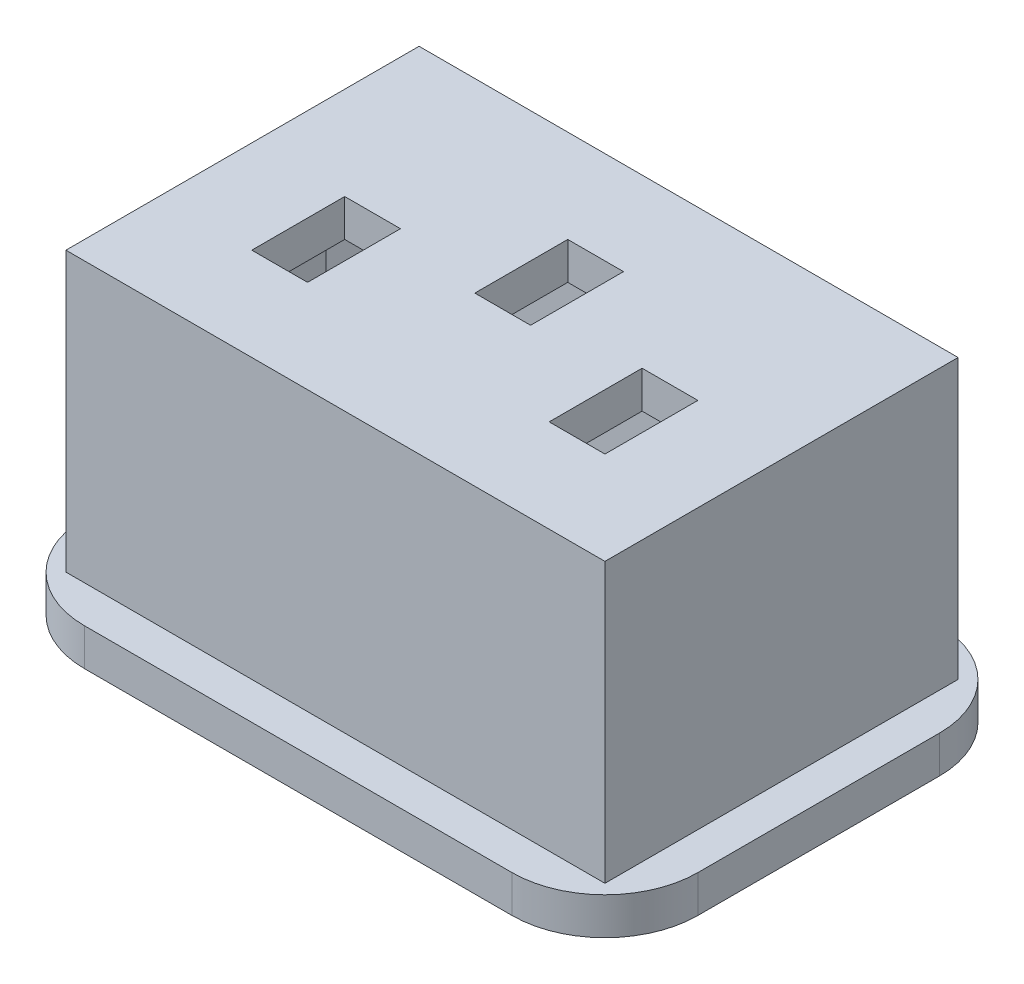
ISO-10303-21;
HEADER;
FILE_DESCRIPTION(('STEP AP214'),'2;1');
FILE_NAME('part.step','',(''),(''),'','','');
FILE_SCHEMA(('AUTOMOTIVE_DESIGN { 1 0 10303 214 1 1 1 1 }'));
ENDSEC;
DATA;
#1=APPLICATION_CONTEXT('core data for automotive mechanical design processes');
#2=APPLICATION_PROTOCOL_DEFINITION('international standard','automotive_design',2000,#1);
#3=PRODUCT_CONTEXT('',#1,'mechanical');
#4=PRODUCT('Part','Part','',(#3));
#5=PRODUCT_RELATED_PRODUCT_CATEGORY('part','',(#4));
#6=PRODUCT_DEFINITION_FORMATION('','',#4);
#7=PRODUCT_DEFINITION_CONTEXT('part definition',#1,'design');
#8=PRODUCT_DEFINITION('design','',#6,#7);
#9=PRODUCT_DEFINITION_SHAPE('','',#8);
#10=(LENGTH_UNIT() NAMED_UNIT(*) SI_UNIT(.MILLI.,.METRE.));
#11=(NAMED_UNIT(*) PLANE_ANGLE_UNIT() SI_UNIT($,.RADIAN.));
#12=(NAMED_UNIT(*) SI_UNIT($,.STERADIAN.) SOLID_ANGLE_UNIT());
#13=UNCERTAINTY_MEASURE_WITH_UNIT(LENGTH_MEASURE(1.E-05),#10,'distance_accuracy_value','');
#14=(GEOMETRIC_REPRESENTATION_CONTEXT(3) GLOBAL_UNCERTAINTY_ASSIGNED_CONTEXT((#13)) GLOBAL_UNIT_ASSIGNED_CONTEXT((#10,
#11,#12)) REPRESENTATION_CONTEXT('',''));
#15=CARTESIAN_POINT('',(0.,0.,0.));
#16=DIRECTION('',(0.,0.,1.));
#17=DIRECTION('',(1.,0.,0.));
#18=AXIS2_PLACEMENT_3D('',#15,#16,#17);
#19=CARTESIAN_POINT('',(1.,-2.,-14.));
#20=DIRECTION('',(0.,-1.,0.));
#21=DIRECTION('',(0.,0.,-1.));
#22=AXIS2_PLACEMENT_3D('',#19,#20,#21);
#23=CYLINDRICAL_SURFACE('',#22,5.);
#24=DIRECTION('',(0.,-1.,0.));
#25=VECTOR('',#24,1.);
#26=CARTESIAN_POINT('',(-4.,-2.,-14.));
#27=LINE('',#26,#25);
#28=CARTESIAN_POINT('',(-4.,0.,-14.));
#29=VERTEX_POINT('',#28);
#30=CARTESIAN_POINT('',(-4.,-2.,-14.));
#31=VERTEX_POINT('',#30);
#32=EDGE_CURVE('E466',#29,#31,#27,.T.);
#33=ORIENTED_EDGE('',*,*,#32,.F.);
#34=CARTESIAN_POINT('',(1.,0.,-14.));
#35=DIRECTION('',(0.,-1.,0.));
#36=DIRECTION('',(0.,0.,-1.));
#37=AXIS2_PLACEMENT_3D('',#34,#35,#36);
#38=CIRCLE('',#37,5.);
#39=CARTESIAN_POINT('',(1.,0.,-19.));
#40=VERTEX_POINT('',#39);
#41=EDGE_CURVE('E40',#40,#29,#38,.F.);
#42=ORIENTED_EDGE('',*,*,#41,.F.);
#43=DIRECTION('',(0.,-1.,0.));
#44=VECTOR('',#43,1.);
#45=CARTESIAN_POINT('',(1.,-2.,-19.));
#46=LINE('',#45,#44);
#47=CARTESIAN_POINT('',(1.,-2.,-19.));
#48=VERTEX_POINT('',#47);
#49=EDGE_CURVE('E469',#48,#40,#46,.F.);
#50=ORIENTED_EDGE('',*,*,#49,.F.);
#51=CARTESIAN_POINT('',(1.,-2.,-14.));
#52=DIRECTION('',(0.,-1.,0.));
#53=DIRECTION('',(0.,0.,-1.));
#54=AXIS2_PLACEMENT_3D('',#51,#52,#53);
#55=CIRCLE('',#54,5.);
#56=EDGE_CURVE('E11',#31,#48,#55,.T.);
#57=ORIENTED_EDGE('',*,*,#56,.F.);
#58=EDGE_LOOP('',(#33,#42,#50,#57));
#59=FACE_BOUND('',#58,.T.);
#60=ADVANCED_FACE('F33',(#59),#23,.T.);
#61=CARTESIAN_POINT('',(0.999999999999999,-2.,-1.));
#62=DIRECTION('',(0.,-1.,0.));
#63=DIRECTION('',(0.,0.,-1.));
#64=AXIS2_PLACEMENT_3D('',#61,#62,#63);
#65=CYLINDRICAL_SURFACE('',#64,5.);
#66=DIRECTION('',(0.,-1.,0.));
#67=VECTOR('',#66,1.);
#68=CARTESIAN_POINT('',(0.999999999999999,-2.,4.));
#69=LINE('',#68,#67);
#70=CARTESIAN_POINT('',(0.999999999999999,0.,4.));
#71=VERTEX_POINT('',#70);
#72=CARTESIAN_POINT('',(0.999999999999999,-2.,4.));
#73=VERTEX_POINT('',#72);
#74=EDGE_CURVE('E456',#71,#73,#69,.T.);
#75=ORIENTED_EDGE('',*,*,#74,.F.);
#76=CARTESIAN_POINT('',(0.999999999999999,0.,-1.));
#77=DIRECTION('',(0.,-1.,0.));
#78=DIRECTION('',(0.,0.,-1.));
#79=AXIS2_PLACEMENT_3D('',#76,#77,#78);
#80=CIRCLE('',#79,5.);
#81=CARTESIAN_POINT('',(-4.,0.,-1.));
#82=VERTEX_POINT('',#81);
#83=EDGE_CURVE('E462',#82,#71,#80,.F.);
#84=ORIENTED_EDGE('',*,*,#83,.F.);
#85=DIRECTION('',(0.,-1.,0.));
#86=VECTOR('',#85,1.);
#87=CARTESIAN_POINT('',(-4.,-2.,-1.));
#88=LINE('',#87,#86);
#89=CARTESIAN_POINT('',(-4.,-2.,-1.));
#90=VERTEX_POINT('',#89);
#91=EDGE_CURVE('E459',#90,#82,#88,.F.);
#92=ORIENTED_EDGE('',*,*,#91,.F.);
#93=CARTESIAN_POINT('',(0.999999999999999,-2.,-1.));
#94=DIRECTION('',(0.,-1.,0.));
#95=DIRECTION('',(0.,0.,-1.));
#96=AXIS2_PLACEMENT_3D('',#93,#94,#95);
#97=CIRCLE('',#96,5.);
#98=EDGE_CURVE('E464',#73,#90,#97,.T.);
#99=ORIENTED_EDGE('',*,*,#98,.F.);
#100=EDGE_LOOP('',(#75,#84,#92,#99));
#101=FACE_BOUND('',#100,.T.);
#102=ADVANCED_FACE('F481',(#101),#65,.T.);
#103=CARTESIAN_POINT('',(24.,-2.,-1.));
#104=DIRECTION('',(0.,-1.,0.));
#105=DIRECTION('',(0.,0.,-1.));
#106=AXIS2_PLACEMENT_3D('',#103,#104,#105);
#107=CYLINDRICAL_SURFACE('',#106,5.);
#108=DIRECTION('',(0.,-1.,0.));
#109=VECTOR('',#108,1.);
#110=CARTESIAN_POINT('',(29.,-2.,-0.999999999999999));
#111=LINE('',#110,#109);
#112=CARTESIAN_POINT('',(29.,0.,-0.999999999999999));
#113=VERTEX_POINT('',#112);
#114=CARTESIAN_POINT('',(29.,-2.,-0.999999999999999));
#115=VERTEX_POINT('',#114);
#116=EDGE_CURVE('E446',#113,#115,#111,.T.);
#117=ORIENTED_EDGE('',*,*,#116,.F.);
#118=CARTESIAN_POINT('',(24.,0.,-1.));
#119=DIRECTION('',(0.,-1.,0.));
#120=DIRECTION('',(0.,0.,-1.));
#121=AXIS2_PLACEMENT_3D('',#118,#119,#120);
#122=CIRCLE('',#121,5.);
#123=CARTESIAN_POINT('',(24.,0.,4.));
#124=VERTEX_POINT('',#123);
#125=EDGE_CURVE('E452',#124,#113,#122,.F.);
#126=ORIENTED_EDGE('',*,*,#125,.F.);
#127=DIRECTION('',(0.,-1.,0.));
#128=VECTOR('',#127,1.);
#129=CARTESIAN_POINT('',(24.,-2.,4.));
#130=LINE('',#129,#128);
#131=CARTESIAN_POINT('',(24.,-2.,4.));
#132=VERTEX_POINT('',#131);
#133=EDGE_CURVE('E449',#132,#124,#130,.F.);
#134=ORIENTED_EDGE('',*,*,#133,.F.);
#135=CARTESIAN_POINT('',(24.,-2.,-1.));
#136=DIRECTION('',(0.,-1.,0.));
#137=DIRECTION('',(0.,0.,-1.));
#138=AXIS2_PLACEMENT_3D('',#135,#136,#137);
#139=CIRCLE('',#138,5.);
#140=EDGE_CURVE('E454',#115,#132,#139,.T.);
#141=ORIENTED_EDGE('',*,*,#140,.F.);
#142=EDGE_LOOP('',(#117,#126,#134,#141));
#143=FACE_BOUND('',#142,.T.);
#144=ADVANCED_FACE('F490',(#143),#107,.T.);
#145=CARTESIAN_POINT('',(24.,-2.,-14.));
#146=DIRECTION('',(0.,-1.,0.));
#147=DIRECTION('',(0.,0.,-1.));
#148=AXIS2_PLACEMENT_3D('',#145,#146,#147);
#149=CYLINDRICAL_SURFACE('',#148,5.);
#150=DIRECTION('',(0.,-1.,0.));
#151=VECTOR('',#150,1.);
#152=CARTESIAN_POINT('',(24.,-2.,-19.));
#153=LINE('',#152,#151);
#154=CARTESIAN_POINT('',(24.,0.,-19.));
#155=VERTEX_POINT('',#154);
#156=CARTESIAN_POINT('',(24.,-2.,-19.));
#157=VERTEX_POINT('',#156);
#158=EDGE_CURVE('E435',#155,#157,#153,.T.);
#159=ORIENTED_EDGE('',*,*,#158,.F.);
#160=CARTESIAN_POINT('',(24.,0.,-14.));
#161=DIRECTION('',(0.,-1.,0.));
#162=DIRECTION('',(0.,0.,-1.));
#163=AXIS2_PLACEMENT_3D('',#160,#161,#162);
#164=CIRCLE('',#163,5.);
#165=CARTESIAN_POINT('',(29.,0.,-14.));
#166=VERTEX_POINT('',#165);
#167=EDGE_CURVE('E441',#166,#155,#164,.F.);
#168=ORIENTED_EDGE('',*,*,#167,.F.);
#169=DIRECTION('',(0.,-1.,0.));
#170=VECTOR('',#169,1.);
#171=CARTESIAN_POINT('',(29.,-2.,-14.));
#172=LINE('',#171,#170);
#173=CARTESIAN_POINT('',(29.,-2.,-14.));
#174=VERTEX_POINT('',#173);
#175=EDGE_CURVE('E438',#174,#166,#172,.F.);
#176=ORIENTED_EDGE('',*,*,#175,.F.);
#177=CARTESIAN_POINT('',(24.,-2.,-14.));
#178=DIRECTION('',(0.,-1.,0.));
#179=DIRECTION('',(0.,0.,-1.));
#180=AXIS2_PLACEMENT_3D('',#177,#178,#179);
#181=CIRCLE('',#180,5.);
#182=EDGE_CURVE('E444',#157,#174,#181,.T.);
#183=ORIENTED_EDGE('',*,*,#182,.F.);
#184=EDGE_LOOP('',(#159,#168,#176,#183));
#185=FACE_BOUND('',#184,.T.);
#186=ADVANCED_FACE('F498',(#185),#149,.T.);
#187=CARTESIAN_POINT('',(-2.,15.,2.));
#188=DIRECTION('',(1.,0.,0.));
#189=DIRECTION('',(0.,0.,-1.));
#190=AXIS2_PLACEMENT_3D('',#187,#188,#189);
#191=PLANE('',#190);
#192=DIRECTION('',(0.,0.,1.));
#193=VECTOR('',#192,1.);
#194=CARTESIAN_POINT('',(-2.,0.,2.));
#195=LINE('',#194,#193);
#196=CARTESIAN_POINT('',(-2.,0.,-17.));
#197=VERTEX_POINT('',#196);
#198=CARTESIAN_POINT('',(-2.,0.,2.));
#199=VERTEX_POINT('',#198);
#200=EDGE_CURVE('E395',#197,#199,#195,.T.);
#201=ORIENTED_EDGE('',*,*,#200,.T.);
#202=DIRECTION('',(0.,-1.,0.));
#203=VECTOR('',#202,1.);
#204=CARTESIAN_POINT('',(-2.,15.,2.));
#205=LINE('',#204,#203);
#206=CARTESIAN_POINT('',(-2.,15.,2.));
#207=VERTEX_POINT('',#206);
#208=EDGE_CURVE('E432',#207,#199,#205,.T.);
#209=ORIENTED_EDGE('',*,*,#208,.F.);
#210=DIRECTION('',(0.,0.,1.));
#211=VECTOR('',#210,1.);
#212=CARTESIAN_POINT('',(-2.,15.,2.));
#213=LINE('',#212,#211);
#214=CARTESIAN_POINT('',(-2.,15.,-17.));
#215=VERTEX_POINT('',#214);
#216=EDGE_CURVE('E403',#215,#207,#213,.T.);
#217=ORIENTED_EDGE('',*,*,#216,.F.);
#218=DIRECTION('',(0.,-1.,0.));
#219=VECTOR('',#218,1.);
#220=CARTESIAN_POINT('',(-2.,15.,-17.));
#221=LINE('',#220,#219);
#222=EDGE_CURVE('E413',#215,#197,#221,.T.);
#223=ORIENTED_EDGE('',*,*,#222,.T.);
#224=EDGE_LOOP('',(#201,#209,#217,#223));
#225=FACE_BOUND('',#224,.T.);
#226=ADVANCED_FACE('F522',(#225),#191,.F.);
#227=CARTESIAN_POINT('',(-2.,15.,2.));
#228=DIRECTION('',(0.,0.,-1.));
#229=DIRECTION('',(-1.,0.,0.));
#230=AXIS2_PLACEMENT_3D('',#227,#228,#229);
#231=PLANE('',#230);
#232=DIRECTION('',(1.,0.,0.));
#233=VECTOR('',#232,1.);
#234=CARTESIAN_POINT('',(-2.,0.,2.));
#235=LINE('',#234,#233);
#236=CARTESIAN_POINT('',(27.,0.,2.));
#237=VERTEX_POINT('',#236);
#238=EDGE_CURVE('E416',#199,#237,#235,.T.);
#239=ORIENTED_EDGE('',*,*,#238,.T.);
#240=DIRECTION('',(0.,-1.,0.));
#241=VECTOR('',#240,1.);
#242=CARTESIAN_POINT('',(27.,15.,2.));
#243=LINE('',#242,#241);
#244=CARTESIAN_POINT('',(27.,15.,2.));
#245=VERTEX_POINT('',#244);
#246=EDGE_CURVE('E429',#245,#237,#243,.T.);
#247=ORIENTED_EDGE('',*,*,#246,.F.);
#248=DIRECTION('',(1.,0.,0.));
#249=VECTOR('',#248,1.);
#250=CARTESIAN_POINT('',(-2.,15.,2.));
#251=LINE('',#250,#249);
#252=EDGE_CURVE('E406',#207,#245,#251,.T.);
#253=ORIENTED_EDGE('',*,*,#252,.F.);
#254=ORIENTED_EDGE('',*,*,#208,.T.);
#255=EDGE_LOOP('',(#239,#247,#253,#254));
#256=FACE_BOUND('',#255,.T.);
#257=ADVANCED_FACE('F525',(#256),#231,.F.);
#258=CARTESIAN_POINT('',(27.,15.,2.));
#259=DIRECTION('',(-1.,0.,0.));
#260=DIRECTION('',(0.,0.,1.));
#261=AXIS2_PLACEMENT_3D('',#258,#259,#260);
#262=PLANE('',#261);
#263=DIRECTION('',(0.,0.,-1.));
#264=VECTOR('',#263,1.);
#265=CARTESIAN_POINT('',(27.,0.,2.));
#266=LINE('',#265,#264);
#267=CARTESIAN_POINT('',(27.,0.,-17.));
#268=VERTEX_POINT('',#267);
#269=EDGE_CURVE('E419',#237,#268,#266,.T.);
#270=ORIENTED_EDGE('',*,*,#269,.T.);
#271=DIRECTION('',(0.,-1.,0.));
#272=VECTOR('',#271,1.);
#273=CARTESIAN_POINT('',(27.,15.,-17.));
#274=LINE('',#273,#272);
#275=CARTESIAN_POINT('',(27.,15.,-17.));
#276=VERTEX_POINT('',#275);
#277=EDGE_CURVE('E426',#276,#268,#274,.T.);
#278=ORIENTED_EDGE('',*,*,#277,.F.);
#279=DIRECTION('',(0.,0.,-1.));
#280=VECTOR('',#279,1.);
#281=CARTESIAN_POINT('',(27.,15.,2.));
#282=LINE('',#281,#280);
#283=EDGE_CURVE('E409',#245,#276,#282,.T.);
#284=ORIENTED_EDGE('',*,*,#283,.F.);
#285=ORIENTED_EDGE('',*,*,#246,.T.);
#286=EDGE_LOOP('',(#270,#278,#284,#285));
#287=FACE_BOUND('',#286,.T.);
#288=ADVANCED_FACE('F529',(#287),#262,.F.);
#289=CARTESIAN_POINT('',(-2.,15.,-17.));
#290=DIRECTION('',(0.,0.,1.));
#291=DIRECTION('',(1.,0.,0.));
#292=AXIS2_PLACEMENT_3D('',#289,#290,#291);
#293=PLANE('',#292);
#294=DIRECTION('',(-1.,0.,0.));
#295=VECTOR('',#294,1.);
#296=CARTESIAN_POINT('',(-2.,0.,-17.));
#297=LINE('',#296,#295);
#298=EDGE_CURVE('E407',#268,#197,#297,.T.);
#299=ORIENTED_EDGE('',*,*,#298,.T.);
#300=ORIENTED_EDGE('',*,*,#222,.F.);
#301=DIRECTION('',(-1.,0.,0.));
#302=VECTOR('',#301,1.);
#303=CARTESIAN_POINT('',(-2.,15.,-17.));
#304=LINE('',#303,#302);
#305=EDGE_CURVE('E411',#276,#215,#304,.T.);
#306=ORIENTED_EDGE('',*,*,#305,.F.);
#307=ORIENTED_EDGE('',*,*,#277,.T.);
#308=EDGE_LOOP('',(#299,#300,#306,#307));
#309=FACE_BOUND('',#308,.T.);
#310=ADVANCED_FACE('F533',(#309),#293,.F.);
#311=CARTESIAN_POINT('',(0.,15.,0.));
#312=DIRECTION('',(0.,-1.,0.));
#313=DIRECTION('',(0.,0.,-1.));
#314=AXIS2_PLACEMENT_3D('',#311,#312,#313);
#315=PLANE('',#314);
#316=DIRECTION('',(-1.,0.,0.));
#317=VECTOR('',#316,1.);
#318=CARTESIAN_POINT('',(0.,15.,-7.));
#319=LINE('',#318,#317);
#320=CARTESIAN_POINT('',(14.,15.,-7.));
#321=VERTEX_POINT('',#320);
#322=CARTESIAN_POINT('',(11.,15.,-7.));
#323=VERTEX_POINT('',#322);
#324=EDGE_CURVE('E342',#321,#323,#319,.T.);
#325=ORIENTED_EDGE('',*,*,#324,.T.);
#326=DIRECTION('',(0.,0.,-1.));
#327=VECTOR('',#326,1.);
#328=CARTESIAN_POINT('',(11.,15.,0.));
#329=LINE('',#328,#327);
#330=CARTESIAN_POINT('',(11.,15.,-12.));
#331=VERTEX_POINT('',#330);
#332=EDGE_CURVE('E345',#323,#331,#329,.T.);
#333=ORIENTED_EDGE('',*,*,#332,.T.);
#334=DIRECTION('',(1.,0.,0.));
#335=VECTOR('',#334,1.);
#336=CARTESIAN_POINT('',(0.,15.,-12.));
#337=LINE('',#336,#335);
#338=CARTESIAN_POINT('',(14.,15.,-12.));
#339=VERTEX_POINT('',#338);
#340=EDGE_CURVE('E336',#331,#339,#337,.T.);
#341=ORIENTED_EDGE('',*,*,#340,.T.);
#342=DIRECTION('',(0.,0.,1.));
#343=VECTOR('',#342,1.);
#344=CARTESIAN_POINT('',(14.,15.,0.));
#345=LINE('',#344,#343);
#346=EDGE_CURVE('E339',#339,#321,#345,.T.);
#347=ORIENTED_EDGE('',*,*,#346,.T.);
#348=EDGE_LOOP('',(#325,#333,#341,#347));
#349=FACE_BOUND('',#348,.T.);
#350=DIRECTION('',(-1.,0.,0.));
#351=VECTOR('',#350,1.);
#352=CARTESIAN_POINT('',(0.,15.,-3.));
#353=LINE('',#352,#351);
#354=CARTESIAN_POINT('',(22.,15.,-3.));
#355=VERTEX_POINT('',#354);
#356=CARTESIAN_POINT('',(19.,15.,-3.));
#357=VERTEX_POINT('',#356);
#358=EDGE_CURVE('E330',#355,#357,#353,.T.);
#359=ORIENTED_EDGE('',*,*,#358,.T.);
#360=DIRECTION('',(0.,0.,-1.));
#361=VECTOR('',#360,1.);
#362=CARTESIAN_POINT('',(19.,15.,0.));
#363=LINE('',#362,#361);
#364=CARTESIAN_POINT('',(19.,15.,-8.));
#365=VERTEX_POINT('',#364);
#366=EDGE_CURVE('E333',#357,#365,#363,.T.);
#367=ORIENTED_EDGE('',*,*,#366,.T.);
#368=DIRECTION('',(1.,0.,0.));
#369=VECTOR('',#368,1.);
#370=CARTESIAN_POINT('',(0.,15.,-8.));
#371=LINE('',#370,#369);
#372=CARTESIAN_POINT('',(22.,15.,-8.));
#373=VERTEX_POINT('',#372);
#374=EDGE_CURVE('E300',#365,#373,#371,.T.);
#375=ORIENTED_EDGE('',*,*,#374,.T.);
#376=DIRECTION('',(0.,0.,1.));
#377=VECTOR('',#376,1.);
#378=CARTESIAN_POINT('',(22.,15.,0.));
#379=LINE('',#378,#377);
#380=EDGE_CURVE('E327',#373,#355,#379,.T.);
#381=ORIENTED_EDGE('',*,*,#380,.T.);
#382=EDGE_LOOP('',(#359,#367,#375,#381));
#383=FACE_BOUND('',#382,.T.);
#384=DIRECTION('',(-1.,0.,0.));
#385=VECTOR('',#384,1.);
#386=CARTESIAN_POINT('',(0.,15.,-3.));
#387=LINE('',#386,#385);
#388=CARTESIAN_POINT('',(6.,15.,-3.));
#389=VERTEX_POINT('',#388);
#390=CARTESIAN_POINT('',(3.,15.,-3.));
#391=VERTEX_POINT('',#390);
#392=EDGE_CURVE('E374',#389,#391,#387,.T.);
#393=ORIENTED_EDGE('',*,*,#392,.T.);
#394=DIRECTION('',(0.,0.,-1.));
#395=VECTOR('',#394,1.);
#396=CARTESIAN_POINT('',(3.,15.,0.));
#397=LINE('',#396,#395);
#398=CARTESIAN_POINT('',(3.,15.,-8.));
#399=VERTEX_POINT('',#398);
#400=EDGE_CURVE('E377',#391,#399,#397,.T.);
#401=ORIENTED_EDGE('',*,*,#400,.T.);
#402=DIRECTION('',(1.,0.,0.));
#403=VECTOR('',#402,1.);
#404=CARTESIAN_POINT('',(0.,15.,-8.));
#405=LINE('',#404,#403);
#406=CARTESIAN_POINT('',(6.,15.,-8.));
#407=VERTEX_POINT('',#406);
#408=EDGE_CURVE('E362',#399,#407,#405,.T.);
#409=ORIENTED_EDGE('',*,*,#408,.T.);
#410=DIRECTION('',(0.,0.,1.));
#411=VECTOR('',#410,1.);
#412=CARTESIAN_POINT('',(6.,15.,0.));
#413=LINE('',#412,#411);
#414=EDGE_CURVE('E371',#407,#389,#413,.T.);
#415=ORIENTED_EDGE('',*,*,#414,.T.);
#416=EDGE_LOOP('',(#393,#401,#409,#415));
#417=FACE_BOUND('',#416,.T.);
#418=ORIENTED_EDGE('',*,*,#216,.T.);
#419=ORIENTED_EDGE('',*,*,#252,.T.);
#420=ORIENTED_EDGE('',*,*,#283,.T.);
#421=ORIENTED_EDGE('',*,*,#305,.T.);
#422=EDGE_LOOP('',(#418,#419,#420,#421));
#423=FACE_BOUND('',#422,.T.);
#424=ADVANCED_FACE('F537',(#349,#383,#417,#423),#315,.F.);
#425=CARTESIAN_POINT('',(25.,13.,0.));
#426=DIRECTION('',(0.,0.,1.));
#427=DIRECTION('',(1.,0.,0.));
#428=AXIS2_PLACEMENT_3D('',#425,#426,#427);
#429=PLANE('',#428);
#430=DIRECTION('',(0.,-1.,0.));
#431=VECTOR('',#430,1.);
#432=CARTESIAN_POINT('',(25.,13.,0.));
#433=LINE('',#432,#431);
#434=CARTESIAN_POINT('',(25.,13.,0.));
#435=VERTEX_POINT('',#434);
#436=CARTESIAN_POINT('',(25.,-2.,0.));
#437=VERTEX_POINT('',#436);
#438=EDGE_CURVE('E243',#435,#437,#433,.T.);
#439=ORIENTED_EDGE('',*,*,#438,.T.);
#440=DIRECTION('',(-1.,0.,0.));
#441=VECTOR('',#440,1.);
#442=CARTESIAN_POINT('',(25.,-2.,0.));
#443=LINE('',#442,#441);
#444=CARTESIAN_POINT('',(0.,-2.,0.));
#445=VERTEX_POINT('',#444);
#446=EDGE_CURVE('E241',#437,#445,#443,.T.);
#447=ORIENTED_EDGE('',*,*,#446,.T.);
#448=DIRECTION('',(0.,-1.,0.));
#449=VECTOR('',#448,1.);
#450=CARTESIAN_POINT('',(0.,13.,0.));
#451=LINE('',#450,#449);
#452=CARTESIAN_POINT('',(0.,13.,0.));
#453=VERTEX_POINT('',#452);
#454=EDGE_CURVE('E226',#453,#445,#451,.T.);
#455=ORIENTED_EDGE('',*,*,#454,.F.);
#456=DIRECTION('',(-1.,0.,0.));
#457=VECTOR('',#456,1.);
#458=CARTESIAN_POINT('',(25.,13.,0.));
#459=LINE('',#458,#457);
#460=EDGE_CURVE('E380',#435,#453,#459,.T.);
#461=ORIENTED_EDGE('',*,*,#460,.F.);
#462=EDGE_LOOP('',(#439,#447,#455,#461));
#463=FACE_BOUND('',#462,.T.);
#464=ADVANCED_FACE('F242',(#463),#429,.F.);
#465=CARTESIAN_POINT('',(25.,13.,-10.));
#466=DIRECTION('',(1.,0.,0.));
#467=DIRECTION('',(0.,0.,-1.));
#468=AXIS2_PLACEMENT_3D('',#465,#466,#467);
#469=PLANE('',#468);
#470=DIRECTION('',(0.,-1.,0.));
#471=VECTOR('',#470,1.);
#472=CARTESIAN_POINT('',(25.,13.,-10.));
#473=LINE('',#472,#471);
#474=CARTESIAN_POINT('',(25.,13.,-10.));
#475=VERTEX_POINT('',#474);
#476=CARTESIAN_POINT('',(25.,-2.,-10.));
#477=VERTEX_POINT('',#476);
#478=EDGE_CURVE('E396',#475,#477,#473,.T.);
#479=ORIENTED_EDGE('',*,*,#478,.T.);
#480=DIRECTION('',(0.,0.,1.));
#481=VECTOR('',#480,1.);
#482=CARTESIAN_POINT('',(25.,-2.,-10.));
#483=LINE('',#482,#481);
#484=EDGE_CURVE('E261',#477,#437,#483,.T.);
#485=ORIENTED_EDGE('',*,*,#484,.T.);
#486=ORIENTED_EDGE('',*,*,#438,.F.);
#487=DIRECTION('',(0.,0.,1.));
#488=VECTOR('',#487,1.);
#489=CARTESIAN_POINT('',(25.,13.,-10.));
#490=LINE('',#489,#488);
#491=EDGE_CURVE('E238',#475,#435,#490,.T.);
#492=ORIENTED_EDGE('',*,*,#491,.F.);
#493=EDGE_LOOP('',(#479,#485,#486,#492));
#494=FACE_BOUND('',#493,.T.);
#495=ADVANCED_FACE('F544',(#494),#469,.F.);
#496=CARTESIAN_POINT('',(20.,13.,-15.));
#497=DIRECTION('',(0.707106781186547,0.,-0.707106781186548));
#498=DIRECTION('',(-0.707106781186548,0.,-0.707106781186547));
#499=AXIS2_PLACEMENT_3D('',#496,#497,#498);
#500=PLANE('',#499);
#501=DIRECTION('',(0.,-1.,0.));
#502=VECTOR('',#501,1.);
#503=CARTESIAN_POINT('',(20.,13.,-15.));
#504=LINE('',#503,#502);
#505=CARTESIAN_POINT('',(20.,13.,-15.));
#506=VERTEX_POINT('',#505);
#507=CARTESIAN_POINT('',(20.,-2.,-15.));
#508=VERTEX_POINT('',#507);
#509=EDGE_CURVE('E398',#506,#508,#504,.T.);
#510=ORIENTED_EDGE('',*,*,#509,.T.);
#511=DIRECTION('',(0.707106781186548,0.,0.707106781186547));
#512=VECTOR('',#511,1.);
#513=CARTESIAN_POINT('',(20.,-2.,-15.));
#514=LINE('',#513,#512);
#515=EDGE_CURVE('E258',#508,#477,#514,.T.);
#516=ORIENTED_EDGE('',*,*,#515,.T.);
#517=ORIENTED_EDGE('',*,*,#478,.F.);
#518=DIRECTION('',(0.707106781186548,0.,0.707106781186547));
#519=VECTOR('',#518,1.);
#520=CARTESIAN_POINT('',(20.,13.,-15.));
#521=LINE('',#520,#519);
#522=EDGE_CURVE('E389',#506,#475,#521,.T.);
#523=ORIENTED_EDGE('',*,*,#522,.F.);
#524=EDGE_LOOP('',(#510,#516,#517,#523));
#525=FACE_BOUND('',#524,.T.);
#526=ADVANCED_FACE('F555',(#525),#500,.F.);
#527=CARTESIAN_POINT('',(5.,13.,-15.));
#528=DIRECTION('',(0.,0.,-1.));
#529=DIRECTION('',(-1.,0.,0.));
#530=AXIS2_PLACEMENT_3D('',#527,#528,#529);
#531=PLANE('',#530);
#532=DIRECTION('',(0.,-1.,0.));
#533=VECTOR('',#532,1.);
#534=CARTESIAN_POINT('',(5.,13.,-15.));
#535=LINE('',#534,#533);
#536=CARTESIAN_POINT('',(5.,13.,-15.));
#537=VERTEX_POINT('',#536);
#538=CARTESIAN_POINT('',(5.,-2.,-15.));
#539=VERTEX_POINT('',#538);
#540=EDGE_CURVE('E400',#537,#539,#535,.T.);
#541=ORIENTED_EDGE('',*,*,#540,.T.);
#542=DIRECTION('',(1.,0.,0.));
#543=VECTOR('',#542,1.);
#544=CARTESIAN_POINT('',(5.,-2.,-15.));
#545=LINE('',#544,#543);
#546=EDGE_CURVE('E253',#539,#508,#545,.T.);
#547=ORIENTED_EDGE('',*,*,#546,.T.);
#548=ORIENTED_EDGE('',*,*,#509,.F.);
#549=DIRECTION('',(1.,0.,0.));
#550=VECTOR('',#549,1.);
#551=CARTESIAN_POINT('',(5.,13.,-15.));
#552=LINE('',#551,#550);
#553=EDGE_CURVE('E386',#537,#506,#552,.T.);
#554=ORIENTED_EDGE('',*,*,#553,.F.);
#555=EDGE_LOOP('',(#541,#547,#548,#554));
#556=FACE_BOUND('',#555,.T.);
#557=ADVANCED_FACE('F551',(#556),#531,.F.);
#558=CARTESIAN_POINT('',(0.,13.,-9.99999999999998));
#559=DIRECTION('',(-0.707106781186548,0.,-0.707106781186547));
#560=DIRECTION('',(-0.707106781186547,0.,0.707106781186548));
#561=AXIS2_PLACEMENT_3D('',#558,#559,#560);
#562=PLANE('',#561);
#563=DIRECTION('',(0.,-1.,0.));
#564=VECTOR('',#563,1.);
#565=CARTESIAN_POINT('',(0.,13.,-9.99999999999998));
#566=LINE('',#565,#564);
#567=CARTESIAN_POINT('',(0.,13.,-9.99999999999998));
#568=VERTEX_POINT('',#567);
#569=CARTESIAN_POINT('',(0.,-2.,-9.99999999999998));
#570=VERTEX_POINT('',#569);
#571=EDGE_CURVE('E237',#568,#570,#566,.T.);
#572=ORIENTED_EDGE('',*,*,#571,.T.);
#573=DIRECTION('',(0.707106781186547,0.,-0.707106781186548));
#574=VECTOR('',#573,1.);
#575=CARTESIAN_POINT('',(0.,-2.,-9.99999999999998));
#576=LINE('',#575,#574);
#577=EDGE_CURVE('E251',#570,#539,#576,.T.);
#578=ORIENTED_EDGE('',*,*,#577,.T.);
#579=ORIENTED_EDGE('',*,*,#540,.F.);
#580=DIRECTION('',(0.707106781186547,0.,-0.707106781186548));
#581=VECTOR('',#580,1.);
#582=CARTESIAN_POINT('',(0.,13.,-9.99999999999998));
#583=LINE('',#582,#581);
#584=EDGE_CURVE('E383',#568,#537,#583,.T.);
#585=ORIENTED_EDGE('',*,*,#584,.F.);
#586=EDGE_LOOP('',(#572,#578,#579,#585));
#587=FACE_BOUND('',#586,.T.);
#588=ADVANCED_FACE('F548',(#587),#562,.F.);
#589=CARTESIAN_POINT('',(0.,13.,0.));
#590=DIRECTION('',(-1.,0.,0.));
#591=DIRECTION('',(0.,0.,1.));
#592=AXIS2_PLACEMENT_3D('',#589,#590,#591);
#593=PLANE('',#592);
#594=ORIENTED_EDGE('',*,*,#454,.T.);
#595=DIRECTION('',(0.,0.,-1.));
#596=VECTOR('',#595,1.);
#597=CARTESIAN_POINT('',(0.,-2.,0.));
#598=LINE('',#597,#596);
#599=EDGE_CURVE('E230',#445,#570,#598,.T.);
#600=ORIENTED_EDGE('',*,*,#599,.T.);
#601=ORIENTED_EDGE('',*,*,#571,.F.);
#602=DIRECTION('',(0.,0.,-1.));
#603=VECTOR('',#602,1.);
#604=CARTESIAN_POINT('',(0.,13.,0.));
#605=LINE('',#604,#603);
#606=EDGE_CURVE('E233',#453,#568,#605,.T.);
#607=ORIENTED_EDGE('',*,*,#606,.F.);
#608=EDGE_LOOP('',(#594,#600,#601,#607));
#609=FACE_BOUND('',#608,.T.);
#610=ADVANCED_FACE('F228',(#609),#593,.F.);
#611=CARTESIAN_POINT('',(0.,13.,0.));
#612=DIRECTION('',(0.,-1.,0.));
#613=DIRECTION('',(0.,0.,-1.));
#614=AXIS2_PLACEMENT_3D('',#611,#612,#613);
#615=PLANE('',#614);
#616=DIRECTION('',(0.,0.,-1.));
#617=VECTOR('',#616,1.);
#618=CARTESIAN_POINT('',(11.,13.,-7.));
#619=LINE('',#618,#617);
#620=CARTESIAN_POINT('',(11.,13.,-7.));
#621=VERTEX_POINT('',#620);
#622=CARTESIAN_POINT('',(11.,13.,-12.));
#623=VERTEX_POINT('',#622);
#624=EDGE_CURVE('E285',#621,#623,#619,.T.);
#625=ORIENTED_EDGE('',*,*,#624,.F.);
#626=DIRECTION('',(-1.,0.,0.));
#627=VECTOR('',#626,1.);
#628=CARTESIAN_POINT('',(11.,13.,-7.));
#629=LINE('',#628,#627);
#630=CARTESIAN_POINT('',(14.,13.,-7.));
#631=VERTEX_POINT('',#630);
#632=EDGE_CURVE('E294',#631,#621,#629,.T.);
#633=ORIENTED_EDGE('',*,*,#632,.F.);
#634=DIRECTION('',(0.,0.,1.));
#635=VECTOR('',#634,1.);
#636=CARTESIAN_POINT('',(14.,13.,-7.));
#637=LINE('',#636,#635);
#638=CARTESIAN_POINT('',(14.,13.,-12.));
#639=VERTEX_POINT('',#638);
#640=EDGE_CURVE('E291',#639,#631,#637,.T.);
#641=ORIENTED_EDGE('',*,*,#640,.F.);
#642=DIRECTION('',(1.,0.,0.));
#643=VECTOR('',#642,1.);
#644=CARTESIAN_POINT('',(11.,13.,-12.));
#645=LINE('',#644,#643);
#646=EDGE_CURVE('E287',#623,#639,#645,.T.);
#647=ORIENTED_EDGE('',*,*,#646,.F.);
#648=EDGE_LOOP('',(#625,#633,#641,#647));
#649=FACE_BOUND('',#648,.T.);
#650=DIRECTION('',(0.,0.,-1.));
#651=VECTOR('',#650,1.);
#652=CARTESIAN_POINT('',(19.,13.,-3.));
#653=LINE('',#652,#651);
#654=CARTESIAN_POINT('',(19.,13.,-3.));
#655=VERTEX_POINT('',#654);
#656=CARTESIAN_POINT('',(19.,13.,-8.));
#657=VERTEX_POINT('',#656);
#658=EDGE_CURVE('E275',#655,#657,#653,.T.);
#659=ORIENTED_EDGE('',*,*,#658,.F.);
#660=DIRECTION('',(-1.,0.,0.));
#661=VECTOR('',#660,1.);
#662=CARTESIAN_POINT('',(19.,13.,-3.));
#663=LINE('',#662,#661);
#664=CARTESIAN_POINT('',(22.,13.,-3.));
#665=VERTEX_POINT('',#664);
#666=EDGE_CURVE('E314',#665,#655,#663,.T.);
#667=ORIENTED_EDGE('',*,*,#666,.F.);
#668=DIRECTION('',(0.,0.,1.));
#669=VECTOR('',#668,1.);
#670=CARTESIAN_POINT('',(22.,13.,-3.));
#671=LINE('',#670,#669);
#672=CARTESIAN_POINT('',(22.,13.,-8.));
#673=VERTEX_POINT('',#672);
#674=EDGE_CURVE('E311',#673,#665,#671,.T.);
#675=ORIENTED_EDGE('',*,*,#674,.F.);
#676=DIRECTION('',(1.,0.,0.));
#677=VECTOR('',#676,1.);
#678=CARTESIAN_POINT('',(19.,13.,-8.));
#679=LINE('',#678,#677);
#680=EDGE_CURVE('E308',#657,#673,#679,.T.);
#681=ORIENTED_EDGE('',*,*,#680,.F.);
#682=EDGE_LOOP('',(#659,#667,#675,#681));
#683=FACE_BOUND('',#682,.T.);
#684=DIRECTION('',(0.,0.,-1.));
#685=VECTOR('',#684,1.);
#686=CARTESIAN_POINT('',(3.,13.,-3.));
#687=LINE('',#686,#685);
#688=CARTESIAN_POINT('',(3.,13.,-3.));
#689=VERTEX_POINT('',#688);
#690=CARTESIAN_POINT('',(3.,13.,-8.));
#691=VERTEX_POINT('',#690);
#692=EDGE_CURVE('E348',#689,#691,#687,.T.);
#693=ORIENTED_EDGE('',*,*,#692,.F.);
#694=DIRECTION('',(-1.,0.,0.));
#695=VECTOR('',#694,1.);
#696=CARTESIAN_POINT('',(3.,13.,-3.));
#697=LINE('',#696,#695);
#698=CARTESIAN_POINT('',(6.,13.,-3.));
#699=VERTEX_POINT('',#698);
#700=EDGE_CURVE('E356',#699,#689,#697,.T.);
#701=ORIENTED_EDGE('',*,*,#700,.F.);
#702=DIRECTION('',(0.,0.,1.));
#703=VECTOR('',#702,1.);
#704=CARTESIAN_POINT('',(6.,13.,-3.));
#705=LINE('',#704,#703);
#706=CARTESIAN_POINT('',(6.,13.,-8.));
#707=VERTEX_POINT('',#706);
#708=EDGE_CURVE('E353',#707,#699,#705,.T.);
#709=ORIENTED_EDGE('',*,*,#708,.F.);
#710=DIRECTION('',(1.,0.,0.));
#711=VECTOR('',#710,1.);
#712=CARTESIAN_POINT('',(3.,13.,-8.));
#713=LINE('',#712,#711);
#714=EDGE_CURVE('E350',#691,#707,#713,.T.);
#715=ORIENTED_EDGE('',*,*,#714,.F.);
#716=EDGE_LOOP('',(#693,#701,#709,#715));
#717=FACE_BOUND('',#716,.T.);
#718=ORIENTED_EDGE('',*,*,#460,.T.);
#719=ORIENTED_EDGE('',*,*,#606,.T.);
#720=ORIENTED_EDGE('',*,*,#584,.T.);
#721=ORIENTED_EDGE('',*,*,#553,.T.);
#722=ORIENTED_EDGE('',*,*,#522,.T.);
#723=ORIENTED_EDGE('',*,*,#491,.T.);
#724=EDGE_LOOP('',(#718,#719,#720,#721,#722,#723));
#725=FACE_BOUND('',#724,.T.);
#726=ADVANCED_FACE('F547',(#649,#683,#717,#725),#615,.T.);
#727=CARTESIAN_POINT('',(3.,26.,-3.));
#728=DIRECTION('',(-1.,0.,0.));
#729=DIRECTION('',(0.,0.,1.));
#730=AXIS2_PLACEMENT_3D('',#727,#728,#729);
#731=PLANE('',#730);
#732=DIRECTION('',(0.,-1.,0.));
#733=VECTOR('',#732,1.);
#734=CARTESIAN_POINT('',(3.,26.,-3.));
#735=LINE('',#734,#733);
#736=EDGE_CURVE('E360',#391,#689,#735,.T.);
#737=ORIENTED_EDGE('',*,*,#736,.T.);
#738=ORIENTED_EDGE('',*,*,#692,.T.);
#739=DIRECTION('',(0.,-1.,0.));
#740=VECTOR('',#739,1.);
#741=CARTESIAN_POINT('',(3.,26.,-8.));
#742=LINE('',#741,#740);
#743=EDGE_CURVE('E359',#399,#691,#742,.T.);
#744=ORIENTED_EDGE('',*,*,#743,.F.);
#745=ORIENTED_EDGE('',*,*,#400,.F.);
#746=EDGE_LOOP('',(#737,#738,#744,#745));
#747=FACE_BOUND('',#746,.T.);
#748=ADVANCED_FACE('F565',(#747),#731,.F.);
#749=CARTESIAN_POINT('',(3.,26.,-3.));
#750=DIRECTION('',(0.,0.,1.));
#751=DIRECTION('',(1.,0.,0.));
#752=AXIS2_PLACEMENT_3D('',#749,#750,#751);
#753=PLANE('',#752);
#754=DIRECTION('',(0.,-1.,0.));
#755=VECTOR('',#754,1.);
#756=CARTESIAN_POINT('',(6.,26.,-3.));
#757=LINE('',#756,#755);
#758=EDGE_CURVE('E363',#389,#699,#757,.T.);
#759=ORIENTED_EDGE('',*,*,#758,.T.);
#760=ORIENTED_EDGE('',*,*,#700,.T.);
#761=ORIENTED_EDGE('',*,*,#736,.F.);
#762=ORIENTED_EDGE('',*,*,#392,.F.);
#763=EDGE_LOOP('',(#759,#760,#761,#762));
#764=FACE_BOUND('',#763,.T.);
#765=ADVANCED_FACE('F569',(#764),#753,.F.);
#766=CARTESIAN_POINT('',(6.,26.,-3.));
#767=DIRECTION('',(1.,0.,0.));
#768=DIRECTION('',(0.,0.,-1.));
#769=AXIS2_PLACEMENT_3D('',#766,#767,#768);
#770=PLANE('',#769);
#771=DIRECTION('',(0.,-1.,0.));
#772=VECTOR('',#771,1.);
#773=CARTESIAN_POINT('',(6.,26.,-8.));
#774=LINE('',#773,#772);
#775=EDGE_CURVE('E365',#407,#707,#774,.T.);
#776=ORIENTED_EDGE('',*,*,#775,.T.);
#777=ORIENTED_EDGE('',*,*,#708,.T.);
#778=ORIENTED_EDGE('',*,*,#758,.F.);
#779=ORIENTED_EDGE('',*,*,#414,.F.);
#780=EDGE_LOOP('',(#776,#777,#778,#779));
#781=FACE_BOUND('',#780,.T.);
#782=ADVANCED_FACE('F575',(#781),#770,.F.);
#783=CARTESIAN_POINT('',(3.,26.,-8.));
#784=DIRECTION('',(0.,0.,-1.));
#785=DIRECTION('',(-1.,0.,0.));
#786=AXIS2_PLACEMENT_3D('',#783,#784,#785);
#787=PLANE('',#786);
#788=ORIENTED_EDGE('',*,*,#743,.T.);
#789=ORIENTED_EDGE('',*,*,#714,.T.);
#790=ORIENTED_EDGE('',*,*,#775,.F.);
#791=ORIENTED_EDGE('',*,*,#408,.F.);
#792=EDGE_LOOP('',(#788,#789,#790,#791));
#793=FACE_BOUND('',#792,.T.);
#794=ADVANCED_FACE('F571',(#793),#787,.F.);
#795=CARTESIAN_POINT('',(19.,26.,-3.));
#796=DIRECTION('',(-1.,0.,0.));
#797=DIRECTION('',(0.,0.,1.));
#798=AXIS2_PLACEMENT_3D('',#795,#796,#797);
#799=PLANE('',#798);
#800=DIRECTION('',(0.,-1.,0.));
#801=VECTOR('',#800,1.);
#802=CARTESIAN_POINT('',(19.,26.,-3.));
#803=LINE('',#802,#801);
#804=EDGE_CURVE('E288',#357,#655,#803,.T.);
#805=ORIENTED_EDGE('',*,*,#804,.T.);
#806=ORIENTED_EDGE('',*,*,#658,.T.);
#807=DIRECTION('',(0.,-1.,0.));
#808=VECTOR('',#807,1.);
#809=CARTESIAN_POINT('',(19.,26.,-8.));
#810=LINE('',#809,#808);
#811=EDGE_CURVE('E317',#365,#657,#810,.T.);
#812=ORIENTED_EDGE('',*,*,#811,.F.);
#813=ORIENTED_EDGE('',*,*,#366,.F.);
#814=EDGE_LOOP('',(#805,#806,#812,#813));
#815=FACE_BOUND('',#814,.T.);
#816=ADVANCED_FACE('F574',(#815),#799,.F.);
#817=CARTESIAN_POINT('',(19.,26.,-3.));
#818=DIRECTION('',(0.,0.,1.));
#819=DIRECTION('',(1.,0.,0.));
#820=AXIS2_PLACEMENT_3D('',#817,#818,#819);
#821=PLANE('',#820);
#822=DIRECTION('',(0.,-1.,0.));
#823=VECTOR('',#822,1.);
#824=CARTESIAN_POINT('',(22.,26.,-3.));
#825=LINE('',#824,#823);
#826=EDGE_CURVE('E319',#355,#665,#825,.T.);
#827=ORIENTED_EDGE('',*,*,#826,.T.);
#828=ORIENTED_EDGE('',*,*,#666,.T.);
#829=ORIENTED_EDGE('',*,*,#804,.F.);
#830=ORIENTED_EDGE('',*,*,#358,.F.);
#831=EDGE_LOOP('',(#827,#828,#829,#830));
#832=FACE_BOUND('',#831,.T.);
#833=ADVANCED_FACE('F585',(#832),#821,.F.);
#834=CARTESIAN_POINT('',(22.,26.,-3.));
#835=DIRECTION('',(1.,0.,0.));
#836=DIRECTION('',(0.,0.,-1.));
#837=AXIS2_PLACEMENT_3D('',#834,#835,#836);
#838=PLANE('',#837);
#839=DIRECTION('',(0.,-1.,0.));
#840=VECTOR('',#839,1.);
#841=CARTESIAN_POINT('',(22.,26.,-8.));
#842=LINE('',#841,#840);
#843=EDGE_CURVE('E321',#373,#673,#842,.T.);
#844=ORIENTED_EDGE('',*,*,#843,.T.);
#845=ORIENTED_EDGE('',*,*,#674,.T.);
#846=ORIENTED_EDGE('',*,*,#826,.F.);
#847=ORIENTED_EDGE('',*,*,#380,.F.);
#848=EDGE_LOOP('',(#844,#845,#846,#847));
#849=FACE_BOUND('',#848,.T.);
#850=ADVANCED_FACE('F591',(#849),#838,.F.);
#851=CARTESIAN_POINT('',(19.,26.,-8.));
#852=DIRECTION('',(0.,0.,-1.));
#853=DIRECTION('',(-1.,0.,0.));
#854=AXIS2_PLACEMENT_3D('',#851,#852,#853);
#855=PLANE('',#854);
#856=ORIENTED_EDGE('',*,*,#811,.T.);
#857=ORIENTED_EDGE('',*,*,#680,.T.);
#858=ORIENTED_EDGE('',*,*,#843,.F.);
#859=ORIENTED_EDGE('',*,*,#374,.F.);
#860=EDGE_LOOP('',(#856,#857,#858,#859));
#861=FACE_BOUND('',#860,.T.);
#862=ADVANCED_FACE('F587',(#861),#855,.F.);
#863=CARTESIAN_POINT('',(11.,26.,-7.));
#864=DIRECTION('',(-1.,0.,0.));
#865=DIRECTION('',(0.,0.,1.));
#866=AXIS2_PLACEMENT_3D('',#863,#864,#865);
#867=PLANE('',#866);
#868=DIRECTION('',(0.,-1.,0.));
#869=VECTOR('',#868,1.);
#870=CARTESIAN_POINT('',(11.,26.,-7.));
#871=LINE('',#870,#869);
#872=EDGE_CURVE('E298',#323,#621,#871,.T.);
#873=ORIENTED_EDGE('',*,*,#872,.T.);
#874=ORIENTED_EDGE('',*,*,#624,.T.);
#875=DIRECTION('',(0.,-1.,0.));
#876=VECTOR('',#875,1.);
#877=CARTESIAN_POINT('',(11.,26.,-12.));
#878=LINE('',#877,#876);
#879=EDGE_CURVE('E297',#331,#623,#878,.T.);
#880=ORIENTED_EDGE('',*,*,#879,.F.);
#881=ORIENTED_EDGE('',*,*,#332,.F.);
#882=EDGE_LOOP('',(#873,#874,#880,#881));
#883=FACE_BOUND('',#882,.T.);
#884=ADVANCED_FACE('F590',(#883),#867,.F.);
#885=CARTESIAN_POINT('',(11.,26.,-7.));
#886=DIRECTION('',(0.,0.,1.));
#887=DIRECTION('',(1.,0.,0.));
#888=AXIS2_PLACEMENT_3D('',#885,#886,#887);
#889=PLANE('',#888);
#890=DIRECTION('',(0.,-1.,0.));
#891=VECTOR('',#890,1.);
#892=CARTESIAN_POINT('',(14.,26.,-7.));
#893=LINE('',#892,#891);
#894=EDGE_CURVE('E301',#321,#631,#893,.T.);
#895=ORIENTED_EDGE('',*,*,#894,.T.);
#896=ORIENTED_EDGE('',*,*,#632,.T.);
#897=ORIENTED_EDGE('',*,*,#872,.F.);
#898=ORIENTED_EDGE('',*,*,#324,.F.);
#899=EDGE_LOOP('',(#895,#896,#897,#898));
#900=FACE_BOUND('',#899,.T.);
#901=ADVANCED_FACE('F601',(#900),#889,.F.);
#902=CARTESIAN_POINT('',(14.,26.,-7.));
#903=DIRECTION('',(1.,0.,0.));
#904=DIRECTION('',(0.,0.,-1.));
#905=AXIS2_PLACEMENT_3D('',#902,#903,#904);
#906=PLANE('',#905);
#907=DIRECTION('',(0.,-1.,0.));
#908=VECTOR('',#907,1.);
#909=CARTESIAN_POINT('',(14.,26.,-12.));
#910=LINE('',#909,#908);
#911=EDGE_CURVE('E303',#339,#639,#910,.T.);
#912=ORIENTED_EDGE('',*,*,#911,.T.);
#913=ORIENTED_EDGE('',*,*,#640,.T.);
#914=ORIENTED_EDGE('',*,*,#894,.F.);
#915=ORIENTED_EDGE('',*,*,#346,.F.);
#916=EDGE_LOOP('',(#912,#913,#914,#915));
#917=FACE_BOUND('',#916,.T.);
#918=ADVANCED_FACE('F605',(#917),#906,.F.);
#919=CARTESIAN_POINT('',(11.,26.,-12.));
#920=DIRECTION('',(0.,0.,-1.));
#921=DIRECTION('',(-1.,0.,0.));
#922=AXIS2_PLACEMENT_3D('',#919,#920,#921);
#923=PLANE('',#922);
#924=ORIENTED_EDGE('',*,*,#879,.T.);
#925=ORIENTED_EDGE('',*,*,#646,.T.);
#926=ORIENTED_EDGE('',*,*,#911,.F.);
#927=ORIENTED_EDGE('',*,*,#340,.F.);
#928=EDGE_LOOP('',(#924,#925,#926,#927));
#929=FACE_BOUND('',#928,.T.);
#930=ADVANCED_FACE('F509',(#929),#923,.F.);
#931=CARTESIAN_POINT('',(0.,0.,0.));
#932=DIRECTION('',(0.,-1.,0.));
#933=DIRECTION('',(0.,0.,-1.));
#934=AXIS2_PLACEMENT_3D('',#931,#932,#933);
#935=PLANE('',#934);
#936=DIRECTION('',(1.,0.,0.));
#937=VECTOR('',#936,1.);
#938=CARTESIAN_POINT('',(-4.,0.,-19.));
#939=LINE('',#938,#937);
#940=EDGE_CURVE('E278',#40,#155,#939,.T.);
#941=ORIENTED_EDGE('',*,*,#940,.F.);
#942=ORIENTED_EDGE('',*,*,#41,.T.);
#943=DIRECTION('',(0.,0.,-1.));
#944=VECTOR('',#943,1.);
#945=CARTESIAN_POINT('',(-4.,0.,4.));
#946=LINE('',#945,#944);
#947=EDGE_CURVE('E263',#82,#29,#946,.T.);
#948=ORIENTED_EDGE('',*,*,#947,.F.);
#949=ORIENTED_EDGE('',*,*,#83,.T.);
#950=DIRECTION('',(-1.,0.,0.));
#951=VECTOR('',#950,1.);
#952=CARTESIAN_POINT('',(-4.,0.,4.));
#953=LINE('',#952,#951);
#954=EDGE_CURVE('E267',#124,#71,#953,.T.);
#955=ORIENTED_EDGE('',*,*,#954,.F.);
#956=ORIENTED_EDGE('',*,*,#125,.T.);
#957=DIRECTION('',(0.,0.,1.));
#958=VECTOR('',#957,1.);
#959=CARTESIAN_POINT('',(29.,0.,4.));
#960=LINE('',#959,#958);
#961=EDGE_CURVE('E280',#166,#113,#960,.T.);
#962=ORIENTED_EDGE('',*,*,#961,.F.);
#963=ORIENTED_EDGE('',*,*,#167,.T.);
#964=EDGE_LOOP('',(#941,#942,#948,#949,#955,#956,#962,#963));
#965=FACE_BOUND('',#964,.T.);
#966=ORIENTED_EDGE('',*,*,#238,.F.);
#967=ORIENTED_EDGE('',*,*,#200,.F.);
#968=ORIENTED_EDGE('',*,*,#298,.F.);
#969=ORIENTED_EDGE('',*,*,#269,.F.);
#970=EDGE_LOOP('',(#966,#967,#968,#969));
#971=FACE_BOUND('',#970,.T.);
#972=ADVANCED_FACE('F473',(#965,#971),#935,.F.);
#973=CARTESIAN_POINT('',(0.,-2.,0.));
#974=DIRECTION('',(0.,-1.,0.));
#975=DIRECTION('',(0.,0.,-1.));
#976=AXIS2_PLACEMENT_3D('',#973,#974,#975);
#977=PLANE('',#976);
#978=DIRECTION('',(0.,0.,-1.));
#979=VECTOR('',#978,1.);
#980=CARTESIAN_POINT('',(-4.,-2.,4.));
#981=LINE('',#980,#979);
#982=EDGE_CURVE('E264',#90,#31,#981,.T.);
#983=ORIENTED_EDGE('',*,*,#982,.T.);
#984=ORIENTED_EDGE('',*,*,#56,.T.);
#985=DIRECTION('',(1.,0.,0.));
#986=VECTOR('',#985,1.);
#987=CARTESIAN_POINT('',(-4.,-2.,-19.));
#988=LINE('',#987,#986);
#989=EDGE_CURVE('E266',#48,#157,#988,.T.);
#990=ORIENTED_EDGE('',*,*,#989,.T.);
#991=ORIENTED_EDGE('',*,*,#182,.T.);
#992=DIRECTION('',(0.,0.,1.));
#993=VECTOR('',#992,1.);
#994=CARTESIAN_POINT('',(29.,-2.,4.));
#995=LINE('',#994,#993);
#996=EDGE_CURVE('E269',#174,#115,#995,.T.);
#997=ORIENTED_EDGE('',*,*,#996,.T.);
#998=ORIENTED_EDGE('',*,*,#140,.T.);
#999=DIRECTION('',(-1.,0.,0.));
#1000=VECTOR('',#999,1.);
#1001=CARTESIAN_POINT('',(-4.,-2.,4.));
#1002=LINE('',#1001,#1000);
#1003=EDGE_CURVE('E272',#132,#73,#1002,.T.);
#1004=ORIENTED_EDGE('',*,*,#1003,.T.);
#1005=ORIENTED_EDGE('',*,*,#98,.T.);
#1006=EDGE_LOOP('',(#983,#984,#990,#991,#997,#998,#1004,#1005));
#1007=FACE_BOUND('',#1006,.T.);
#1008=ORIENTED_EDGE('',*,*,#599,.F.);
#1009=ORIENTED_EDGE('',*,*,#446,.F.);
#1010=ORIENTED_EDGE('',*,*,#484,.F.);
#1011=ORIENTED_EDGE('',*,*,#515,.F.);
#1012=ORIENTED_EDGE('',*,*,#546,.F.);
#1013=ORIENTED_EDGE('',*,*,#577,.F.);
#1014=EDGE_LOOP('',(#1008,#1009,#1010,#1011,#1012,#1013));
#1015=FACE_BOUND('',#1014,.T.);
#1016=ADVANCED_FACE('F248',(#1007,#1015),#977,.T.);
#1017=CARTESIAN_POINT('',(-4.,-2.,4.));
#1018=DIRECTION('',(1.,0.,0.));
#1019=DIRECTION('',(0.,0.,-1.));
#1020=AXIS2_PLACEMENT_3D('',#1017,#1018,#1019);
#1021=PLANE('',#1020);
#1022=ORIENTED_EDGE('',*,*,#947,.T.);
#1023=ORIENTED_EDGE('',*,*,#32,.T.);
#1024=ORIENTED_EDGE('',*,*,#982,.F.);
#1025=ORIENTED_EDGE('',*,*,#91,.T.);
#1026=EDGE_LOOP('',(#1022,#1023,#1024,#1025));
#1027=FACE_BOUND('',#1026,.T.);
#1028=ADVANCED_FACE('F477',(#1027),#1021,.F.);
#1029=CARTESIAN_POINT('',(-4.,-2.,-19.));
#1030=DIRECTION('',(0.,0.,1.));
#1031=DIRECTION('',(1.,0.,0.));
#1032=AXIS2_PLACEMENT_3D('',#1029,#1030,#1031);
#1033=PLANE('',#1032);
#1034=ORIENTED_EDGE('',*,*,#989,.F.);
#1035=ORIENTED_EDGE('',*,*,#49,.T.);
#1036=ORIENTED_EDGE('',*,*,#940,.T.);
#1037=ORIENTED_EDGE('',*,*,#158,.T.);
#1038=EDGE_LOOP('',(#1034,#1035,#1036,#1037));
#1039=FACE_BOUND('',#1038,.T.);
#1040=ADVANCED_FACE('F501',(#1039),#1033,.F.);
#1041=CARTESIAN_POINT('',(29.,-2.,4.));
#1042=DIRECTION('',(-1.,0.,0.));
#1043=DIRECTION('',(0.,0.,1.));
#1044=AXIS2_PLACEMENT_3D('',#1041,#1042,#1043);
#1045=PLANE('',#1044);
#1046=ORIENTED_EDGE('',*,*,#961,.T.);
#1047=ORIENTED_EDGE('',*,*,#116,.T.);
#1048=ORIENTED_EDGE('',*,*,#996,.F.);
#1049=ORIENTED_EDGE('',*,*,#175,.T.);
#1050=EDGE_LOOP('',(#1046,#1047,#1048,#1049));
#1051=FACE_BOUND('',#1050,.T.);
#1052=ADVANCED_FACE('F493',(#1051),#1045,.F.);
#1053=CARTESIAN_POINT('',(-4.,-2.,4.));
#1054=DIRECTION('',(0.,0.,-1.));
#1055=DIRECTION('',(-1.,0.,0.));
#1056=AXIS2_PLACEMENT_3D('',#1053,#1054,#1055);
#1057=PLANE('',#1056);
#1058=ORIENTED_EDGE('',*,*,#954,.T.);
#1059=ORIENTED_EDGE('',*,*,#74,.T.);
#1060=ORIENTED_EDGE('',*,*,#1003,.F.);
#1061=ORIENTED_EDGE('',*,*,#133,.T.);
#1062=EDGE_LOOP('',(#1058,#1059,#1060,#1061));
#1063=FACE_BOUND('',#1062,.T.);
#1064=ADVANCED_FACE('F486',(#1063),#1057,.F.);
#1065=CLOSED_SHELL('',(#60,#102,#144,#186,#226,#257,#288,#310,#424,#464,#495,#526,#557,#588,
#610,#726,#748,#765,#782,#794,#816,#833,#850,#862,#884,#901,#918,#930,#972,#1016,#1028,#1040,
#1052,#1064));
#1066=MANIFOLD_SOLID_BREP('B2',#1065);
#1067=ADVANCED_BREP_SHAPE_REPRESENTATION('',(#18,#1066),#14);
#1068=SHAPE_DEFINITION_REPRESENTATION(#9,#1067);
ENDSEC;
END-ISO-10303-21;
